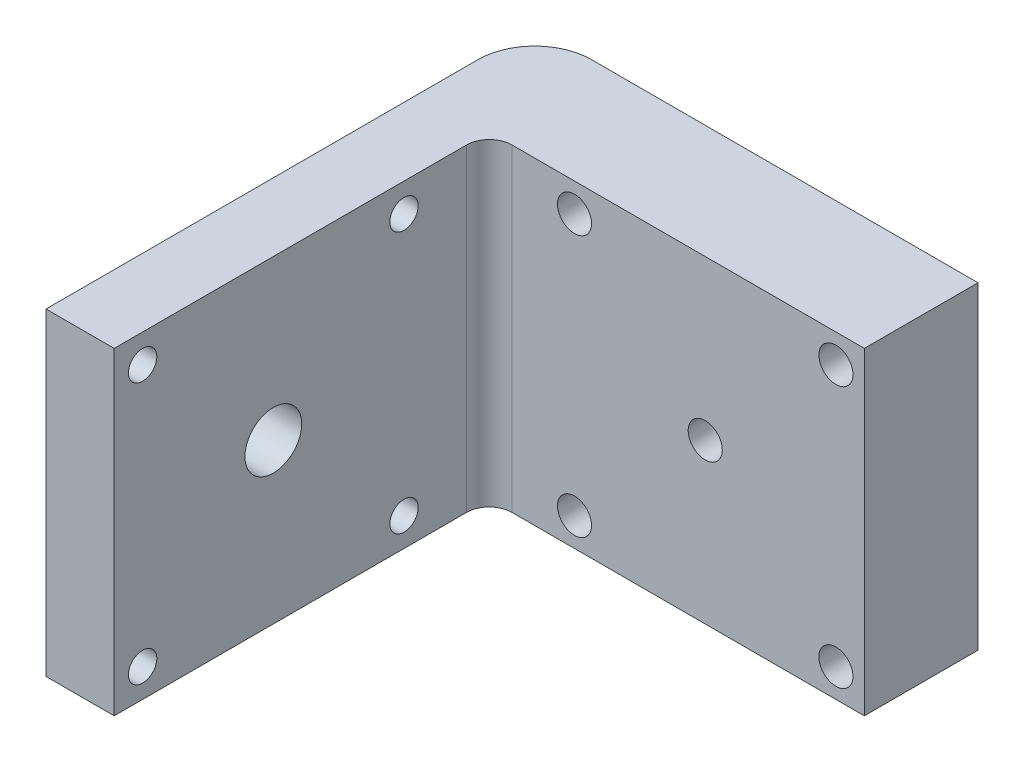
ISO-10303-21;
HEADER;
FILE_DESCRIPTION(('STEP AP214'),'2;1');
FILE_NAME('part.step','',(''),(''),'','','');
FILE_SCHEMA(('AUTOMOTIVE_DESIGN { 1 0 10303 214 1 1 1 1 }'));
ENDSEC;
DATA;
#1=APPLICATION_CONTEXT('core data for automotive mechanical design processes');
#2=APPLICATION_PROTOCOL_DEFINITION('international standard','automotive_design',2000,#1);
#3=PRODUCT_CONTEXT('',#1,'mechanical');
#4=PRODUCT('Part','Part','',(#3));
#5=PRODUCT_RELATED_PRODUCT_CATEGORY('part','',(#4));
#6=PRODUCT_DEFINITION_FORMATION('','',#4);
#7=PRODUCT_DEFINITION_CONTEXT('part definition',#1,'design');
#8=PRODUCT_DEFINITION('design','',#6,#7);
#9=PRODUCT_DEFINITION_SHAPE('','',#8);
#10=(LENGTH_UNIT() NAMED_UNIT(*) SI_UNIT(.MILLI.,.METRE.));
#11=(NAMED_UNIT(*) PLANE_ANGLE_UNIT() SI_UNIT($,.RADIAN.));
#12=(NAMED_UNIT(*) SI_UNIT($,.STERADIAN.) SOLID_ANGLE_UNIT());
#13=UNCERTAINTY_MEASURE_WITH_UNIT(LENGTH_MEASURE(1.E-05),#10,'distance_accuracy_value','');
#14=(GEOMETRIC_REPRESENTATION_CONTEXT(3) GLOBAL_UNCERTAINTY_ASSIGNED_CONTEXT((#13)) GLOBAL_UNIT_ASSIGNED_CONTEXT((#10,
#11,#12)) REPRESENTATION_CONTEXT('',''));
#15=CARTESIAN_POINT('',(0.,0.,0.));
#16=DIRECTION('',(0.,0.,1.));
#17=DIRECTION('',(1.,0.,0.));
#18=AXIS2_PLACEMENT_3D('',#15,#16,#17);
#19=CARTESIAN_POINT('',(0.,14.,10.));
#20=DIRECTION('',(0.,-1.,0.));
#21=DIRECTION('',(0.,0.,-1.));
#22=AXIS2_PLACEMENT_3D('',#19,#20,#21);
#23=PLANE('',#22);
#24=DIRECTION('',(-1.,0.,0.));
#25=VECTOR('',#24,1.);
#26=CARTESIAN_POINT('',(0.,14.,0.));
#27=LINE('',#26,#25);
#28=CARTESIAN_POINT('',(14.,14.,0.));
#29=VERTEX_POINT('',#28);
#30=CARTESIAN_POINT('',(-20.,14.,0.));
#31=VERTEX_POINT('',#30);
#32=EDGE_CURVE('E125',#29,#31,#27,.T.);
#33=ORIENTED_EDGE('',*,*,#32,.T.);
#34=CARTESIAN_POINT('',(-20.,14.,5.));
#35=DIRECTION('',(0.,-1.,0.));
#36=DIRECTION('',(0.,0.,-1.));
#37=AXIS2_PLACEMENT_3D('',#34,#35,#36);
#38=CIRCLE('',#37,5.);
#39=CARTESIAN_POINT('',(-25.,14.,5.));
#40=VERTEX_POINT('',#39);
#41=EDGE_CURVE('E256',#31,#40,#38,.F.);
#42=ORIENTED_EDGE('',*,*,#41,.T.);
#43=DIRECTION('',(0.,0.,-1.));
#44=VECTOR('',#43,1.);
#45=CARTESIAN_POINT('',(-25.,14.,0.));
#46=LINE('',#45,#44);
#47=CARTESIAN_POINT('',(-25.,14.,43.));
#48=VERTEX_POINT('',#47);
#49=EDGE_CURVE('E131',#48,#40,#46,.T.);
#50=ORIENTED_EDGE('',*,*,#49,.F.);
#51=DIRECTION('',(1.,0.,0.));
#52=VECTOR('',#51,1.);
#53=CARTESIAN_POINT('',(-25.,14.,43.));
#54=LINE('',#53,#52);
#55=CARTESIAN_POINT('',(-19.,14.,43.));
#56=VERTEX_POINT('',#55);
#57=EDGE_CURVE('E126',#48,#56,#54,.T.);
#58=ORIENTED_EDGE('',*,*,#57,.T.);
#59=DIRECTION('',(0.,0.,-1.));
#60=VECTOR('',#59,1.);
#61=CARTESIAN_POINT('',(-19.,14.,0.));
#62=LINE('',#61,#60);
#63=CARTESIAN_POINT('',(-19.,14.,12.));
#64=VERTEX_POINT('',#63);
#65=EDGE_CURVE('E162',#56,#64,#62,.T.);
#66=ORIENTED_EDGE('',*,*,#65,.T.);
#67=CARTESIAN_POINT('',(-17.,14.,12.));
#68=DIRECTION('',(0.,-1.,0.));
#69=DIRECTION('',(0.,0.,-1.));
#70=AXIS2_PLACEMENT_3D('',#67,#68,#69);
#71=CIRCLE('',#70,2.);
#72=CARTESIAN_POINT('',(-17.,14.,10.));
#73=VERTEX_POINT('',#72);
#74=EDGE_CURVE('E11',#64,#73,#71,.T.);
#75=ORIENTED_EDGE('',*,*,#74,.T.);
#76=DIRECTION('',(-1.,0.,0.));
#77=VECTOR('',#76,1.);
#78=CARTESIAN_POINT('',(0.,14.,10.));
#79=LINE('',#78,#77);
#80=CARTESIAN_POINT('',(14.,14.,10.));
#81=VERTEX_POINT('',#80);
#82=EDGE_CURVE('E180',#81,#73,#79,.T.);
#83=ORIENTED_EDGE('',*,*,#82,.F.);
#84=DIRECTION('',(0.,0.,-1.));
#85=VECTOR('',#84,1.);
#86=CARTESIAN_POINT('',(14.,14.,10.));
#87=LINE('',#86,#85);
#88=EDGE_CURVE('E212',#81,#29,#87,.T.);
#89=ORIENTED_EDGE('',*,*,#88,.T.);
#90=EDGE_LOOP('',(#33,#42,#50,#58,#66,#75,#83,#89));
#91=FACE_BOUND('',#90,.T.);
#92=ADVANCED_FACE('F39',(#91),#23,.F.);
#93=CARTESIAN_POINT('',(0.,-14.,10.));
#94=DIRECTION('',(0.,-1.,0.));
#95=DIRECTION('',(0.,0.,-1.));
#96=AXIS2_PLACEMENT_3D('',#93,#94,#95);
#97=PLANE('',#96);
#98=DIRECTION('',(0.,0.,1.));
#99=VECTOR('',#98,1.);
#100=CARTESIAN_POINT('',(-25.,-14.,0.));
#101=LINE('',#100,#99);
#102=CARTESIAN_POINT('',(-25.,-14.,5.));
#103=VERTEX_POINT('',#102);
#104=CARTESIAN_POINT('',(-25.,-14.,43.));
#105=VERTEX_POINT('',#104);
#106=EDGE_CURVE('E105',#103,#105,#101,.T.);
#107=ORIENTED_EDGE('',*,*,#106,.F.);
#108=CARTESIAN_POINT('',(-20.,-14.,5.));
#109=DIRECTION('',(0.,-1.,0.));
#110=DIRECTION('',(0.,0.,-1.));
#111=AXIS2_PLACEMENT_3D('',#108,#109,#110);
#112=CIRCLE('',#111,5.);
#113=CARTESIAN_POINT('',(-20.,-14.,0.));
#114=VERTEX_POINT('',#113);
#115=EDGE_CURVE('E250',#103,#114,#112,.T.);
#116=ORIENTED_EDGE('',*,*,#115,.T.);
#117=DIRECTION('',(-1.,0.,0.));
#118=VECTOR('',#117,1.);
#119=CARTESIAN_POINT('',(0.,-14.,0.));
#120=LINE('',#119,#118);
#121=CARTESIAN_POINT('',(14.,-14.,0.));
#122=VERTEX_POINT('',#121);
#123=EDGE_CURVE('E216',#122,#114,#120,.T.);
#124=ORIENTED_EDGE('',*,*,#123,.F.);
#125=DIRECTION('',(0.,0.,-1.));
#126=VECTOR('',#125,1.);
#127=CARTESIAN_POINT('',(14.,-14.,10.));
#128=LINE('',#127,#126);
#129=CARTESIAN_POINT('',(14.,-14.,10.));
#130=VERTEX_POINT('',#129);
#131=EDGE_CURVE('E245',#130,#122,#128,.T.);
#132=ORIENTED_EDGE('',*,*,#131,.F.);
#133=DIRECTION('',(-1.,0.,0.));
#134=VECTOR('',#133,1.);
#135=CARTESIAN_POINT('',(0.,-14.,10.));
#136=LINE('',#135,#134);
#137=CARTESIAN_POINT('',(-17.,-14.,10.));
#138=VERTEX_POINT('',#137);
#139=EDGE_CURVE('E184',#130,#138,#136,.T.);
#140=ORIENTED_EDGE('',*,*,#139,.T.);
#141=CARTESIAN_POINT('',(-17.,-14.,12.));
#142=DIRECTION('',(0.,-1.,0.));
#143=DIRECTION('',(0.,0.,-1.));
#144=AXIS2_PLACEMENT_3D('',#141,#142,#143);
#145=CIRCLE('',#144,2.);
#146=CARTESIAN_POINT('',(-19.,-14.,12.));
#147=VERTEX_POINT('',#146);
#148=EDGE_CURVE('E48',#138,#147,#145,.F.);
#149=ORIENTED_EDGE('',*,*,#148,.T.);
#150=DIRECTION('',(0.,0.,1.));
#151=VECTOR('',#150,1.);
#152=CARTESIAN_POINT('',(-19.,-14.,0.));
#153=LINE('',#152,#151);
#154=CARTESIAN_POINT('',(-19.,-14.,43.));
#155=VERTEX_POINT('',#154);
#156=EDGE_CURVE('E120',#147,#155,#153,.T.);
#157=ORIENTED_EDGE('',*,*,#156,.T.);
#158=DIRECTION('',(1.,0.,0.));
#159=VECTOR('',#158,1.);
#160=CARTESIAN_POINT('',(-25.,-14.,43.));
#161=LINE('',#160,#159);
#162=EDGE_CURVE('E118',#105,#155,#161,.T.);
#163=ORIENTED_EDGE('',*,*,#162,.F.);
#164=EDGE_LOOP('',(#107,#116,#124,#132,#140,#149,#157,#163));
#165=FACE_BOUND('',#164,.T.);
#166=ADVANCED_FACE('F119',(#165),#97,.T.);
#167=CARTESIAN_POINT('',(11.5,11.5,10.));
#168=DIRECTION('',(0.,0.,-1.));
#169=DIRECTION('',(-1.,0.,0.));
#170=AXIS2_PLACEMENT_3D('',#167,#168,#169);
#171=CYLINDRICAL_SURFACE('',#170,1.49999999999999);
#172=CARTESIAN_POINT('',(11.5,11.5,10.));
#173=DIRECTION('',(0.,0.,1.));
#174=DIRECTION('',(1.,0.,0.));
#175=AXIS2_PLACEMENT_3D('',#172,#173,#174);
#176=CIRCLE('',#175,1.49999999999999);
#177=CARTESIAN_POINT('',(13.,11.5,10.));
#178=VERTEX_POINT('',#177);
#179=EDGE_CURVE('E204',#178,#178,#176,.T.);
#180=ORIENTED_EDGE('',*,*,#179,.T.);
#181=EDGE_LOOP('',(#180));
#182=FACE_BOUND('',#181,.T.);
#183=CARTESIAN_POINT('',(11.5,11.5,0.));
#184=DIRECTION('',(0.,0.,1.));
#185=DIRECTION('',(1.,0.,0.));
#186=AXIS2_PLACEMENT_3D('',#183,#184,#185);
#187=CIRCLE('',#186,1.49999999999999);
#188=CARTESIAN_POINT('',(13.,11.5,0.));
#189=VERTEX_POINT('',#188);
#190=EDGE_CURVE('E236',#189,#189,#187,.T.);
#191=ORIENTED_EDGE('',*,*,#190,.F.);
#192=EDGE_LOOP('',(#191));
#193=FACE_BOUND('',#192,.T.);
#194=ADVANCED_FACE('F292',(#182,#193),#171,.F.);
#195=CARTESIAN_POINT('',(-11.5,-11.5,10.));
#196=DIRECTION('',(0.,0.,-1.));
#197=DIRECTION('',(-1.,0.,0.));
#198=AXIS2_PLACEMENT_3D('',#195,#196,#197);
#199=CYLINDRICAL_SURFACE('',#198,1.5);
#200=CARTESIAN_POINT('',(-11.5,-11.5,10.));
#201=DIRECTION('',(0.,0.,1.));
#202=DIRECTION('',(1.,0.,0.));
#203=AXIS2_PLACEMENT_3D('',#200,#201,#202);
#204=CIRCLE('',#203,1.5);
#205=CARTESIAN_POINT('',(-10.,-11.5,10.));
#206=VERTEX_POINT('',#205);
#207=EDGE_CURVE('E200',#206,#206,#204,.T.);
#208=ORIENTED_EDGE('',*,*,#207,.T.);
#209=EDGE_LOOP('',(#208));
#210=FACE_BOUND('',#209,.T.);
#211=CARTESIAN_POINT('',(-11.5,-11.5,0.));
#212=DIRECTION('',(0.,0.,1.));
#213=DIRECTION('',(1.,0.,0.));
#214=AXIS2_PLACEMENT_3D('',#211,#212,#213);
#215=CIRCLE('',#214,1.5);
#216=CARTESIAN_POINT('',(-10.,-11.5,0.));
#217=VERTEX_POINT('',#216);
#218=EDGE_CURVE('E232',#217,#217,#215,.T.);
#219=ORIENTED_EDGE('',*,*,#218,.F.);
#220=EDGE_LOOP('',(#219));
#221=FACE_BOUND('',#220,.T.);
#222=ADVANCED_FACE('F305',(#210,#221),#199,.F.);
#223=CARTESIAN_POINT('',(11.5,-11.5,10.));
#224=DIRECTION('',(0.,0.,-1.));
#225=DIRECTION('',(-1.,0.,0.));
#226=AXIS2_PLACEMENT_3D('',#223,#224,#225);
#227=CYLINDRICAL_SURFACE('',#226,1.49999999999999);
#228=CARTESIAN_POINT('',(11.5,-11.5,10.));
#229=DIRECTION('',(0.,0.,1.));
#230=DIRECTION('',(1.,0.,0.));
#231=AXIS2_PLACEMENT_3D('',#228,#229,#230);
#232=CIRCLE('',#231,1.49999999999999);
#233=CARTESIAN_POINT('',(13.,-11.5,10.));
#234=VERTEX_POINT('',#233);
#235=EDGE_CURVE('E196',#234,#234,#232,.T.);
#236=ORIENTED_EDGE('',*,*,#235,.T.);
#237=EDGE_LOOP('',(#236));
#238=FACE_BOUND('',#237,.T.);
#239=CARTESIAN_POINT('',(11.5,-11.5,0.));
#240=DIRECTION('',(0.,0.,1.));
#241=DIRECTION('',(1.,0.,0.));
#242=AXIS2_PLACEMENT_3D('',#239,#240,#241);
#243=CIRCLE('',#242,1.49999999999999);
#244=CARTESIAN_POINT('',(13.,-11.5,0.));
#245=VERTEX_POINT('',#244);
#246=EDGE_CURVE('E228',#245,#245,#243,.T.);
#247=ORIENTED_EDGE('',*,*,#246,.F.);
#248=EDGE_LOOP('',(#247));
#249=FACE_BOUND('',#248,.T.);
#250=ADVANCED_FACE('F301',(#238,#249),#227,.F.);
#251=CARTESIAN_POINT('',(0.,0.,10.));
#252=DIRECTION('',(0.,0.,-1.));
#253=DIRECTION('',(-1.,0.,0.));
#254=AXIS2_PLACEMENT_3D('',#251,#252,#253);
#255=CYLINDRICAL_SURFACE('',#254,1.5);
#256=CARTESIAN_POINT('',(0.,0.,10.));
#257=DIRECTION('',(0.,0.,1.));
#258=DIRECTION('',(1.,0.,0.));
#259=AXIS2_PLACEMENT_3D('',#256,#257,#258);
#260=CIRCLE('',#259,1.5);
#261=CARTESIAN_POINT('',(1.5,0.,10.));
#262=VERTEX_POINT('',#261);
#263=EDGE_CURVE('E192',#262,#262,#260,.T.);
#264=ORIENTED_EDGE('',*,*,#263,.T.);
#265=EDGE_LOOP('',(#264));
#266=FACE_BOUND('',#265,.T.);
#267=CARTESIAN_POINT('',(0.,0.,0.));
#268=DIRECTION('',(0.,0.,1.));
#269=DIRECTION('',(1.,0.,0.));
#270=AXIS2_PLACEMENT_3D('',#267,#268,#269);
#271=CIRCLE('',#270,1.5);
#272=CARTESIAN_POINT('',(1.5,0.,0.));
#273=VERTEX_POINT('',#272);
#274=EDGE_CURVE('E224',#273,#273,#271,.T.);
#275=ORIENTED_EDGE('',*,*,#274,.F.);
#276=EDGE_LOOP('',(#275));
#277=FACE_BOUND('',#276,.T.);
#278=ADVANCED_FACE('F298',(#266,#277),#255,.F.);
#279=CARTESIAN_POINT('',(14.,0.,10.));
#280=DIRECTION('',(1.,0.,0.));
#281=DIRECTION('',(0.,1.,0.));
#282=AXIS2_PLACEMENT_3D('',#279,#280,#281);
#283=PLANE('',#282);
#284=DIRECTION('',(0.,-1.,0.));
#285=VECTOR('',#284,1.);
#286=CARTESIAN_POINT('',(14.,0.,0.));
#287=LINE('',#286,#285);
#288=EDGE_CURVE('E220',#29,#122,#287,.T.);
#289=ORIENTED_EDGE('',*,*,#288,.F.);
#290=ORIENTED_EDGE('',*,*,#88,.F.);
#291=DIRECTION('',(0.,-1.,0.));
#292=VECTOR('',#291,1.);
#293=CARTESIAN_POINT('',(14.,0.,10.));
#294=LINE('',#293,#292);
#295=EDGE_CURVE('E188',#81,#130,#294,.T.);
#296=ORIENTED_EDGE('',*,*,#295,.T.);
#297=ORIENTED_EDGE('',*,*,#131,.T.);
#298=EDGE_LOOP('',(#289,#290,#296,#297));
#299=FACE_BOUND('',#298,.T.);
#300=ADVANCED_FACE('F277',(#299),#283,.T.);
#301=CARTESIAN_POINT('',(-11.5,11.5,10.));
#302=DIRECTION('',(0.,0.,-1.));
#303=DIRECTION('',(-1.,0.,0.));
#304=AXIS2_PLACEMENT_3D('',#301,#302,#303);
#305=CYLINDRICAL_SURFACE('',#304,1.5);
#306=CARTESIAN_POINT('',(-11.5,11.5,10.));
#307=DIRECTION('',(0.,0.,1.));
#308=DIRECTION('',(1.,0.,0.));
#309=AXIS2_PLACEMENT_3D('',#306,#307,#308);
#310=CIRCLE('',#309,1.5);
#311=CARTESIAN_POINT('',(-10.,11.5,10.));
#312=VERTEX_POINT('',#311);
#313=EDGE_CURVE('E208',#312,#312,#310,.T.);
#314=ORIENTED_EDGE('',*,*,#313,.T.);
#315=EDGE_LOOP('',(#314));
#316=FACE_BOUND('',#315,.T.);
#317=CARTESIAN_POINT('',(-11.5,11.5,0.));
#318=DIRECTION('',(0.,0.,1.));
#319=DIRECTION('',(1.,0.,0.));
#320=AXIS2_PLACEMENT_3D('',#317,#318,#319);
#321=CIRCLE('',#320,1.5);
#322=CARTESIAN_POINT('',(-10.,11.5,0.));
#323=VERTEX_POINT('',#322);
#324=EDGE_CURVE('E185',#323,#323,#321,.T.);
#325=ORIENTED_EDGE('',*,*,#324,.F.);
#326=EDGE_LOOP('',(#325));
#327=FACE_BOUND('',#326,.T.);
#328=ADVANCED_FACE('F297',(#316,#327),#305,.F.);
#329=CARTESIAN_POINT('',(0.,0.,10.));
#330=DIRECTION('',(0.,0.,1.));
#331=DIRECTION('',(1.,0.,0.));
#332=AXIS2_PLACEMENT_3D('',#329,#330,#331);
#333=PLANE('',#332);
#334=ORIENTED_EDGE('',*,*,#82,.T.);
#335=DIRECTION('',(0.,-1.,0.));
#336=VECTOR('',#335,1.);
#337=CARTESIAN_POINT('',(-17.,0.,10.));
#338=LINE('',#337,#336);
#339=EDGE_CURVE('E259',#73,#138,#338,.T.);
#340=ORIENTED_EDGE('',*,*,#339,.T.);
#341=ORIENTED_EDGE('',*,*,#139,.F.);
#342=ORIENTED_EDGE('',*,*,#295,.F.);
#343=EDGE_LOOP('',(#334,#340,#341,#342));
#344=FACE_BOUND('',#343,.T.);
#345=ORIENTED_EDGE('',*,*,#263,.F.);
#346=EDGE_LOOP('',(#345));
#347=FACE_BOUND('',#346,.T.);
#348=ORIENTED_EDGE('',*,*,#235,.F.);
#349=EDGE_LOOP('',(#348));
#350=FACE_BOUND('',#349,.T.);
#351=ORIENTED_EDGE('',*,*,#207,.F.);
#352=EDGE_LOOP('',(#351));
#353=FACE_BOUND('',#352,.T.);
#354=ORIENTED_EDGE('',*,*,#179,.F.);
#355=EDGE_LOOP('',(#354));
#356=FACE_BOUND('',#355,.T.);
#357=ORIENTED_EDGE('',*,*,#313,.F.);
#358=EDGE_LOOP('',(#357));
#359=FACE_BOUND('',#358,.T.);
#360=ADVANCED_FACE('F268',(#344,#347,#350,#353,#356,#359),#333,.T.);
#361=CARTESIAN_POINT('',(0.,0.,0.));
#362=DIRECTION('',(0.,0.,1.));
#363=DIRECTION('',(1.,0.,0.));
#364=AXIS2_PLACEMENT_3D('',#361,#362,#363);
#365=PLANE('',#364);
#366=ORIENTED_EDGE('',*,*,#123,.T.);
#367=DIRECTION('',(0.,-1.,0.));
#368=VECTOR('',#367,1.);
#369=CARTESIAN_POINT('',(-20.,14.,0.));
#370=LINE('',#369,#368);
#371=EDGE_CURVE('E253',#114,#31,#370,.F.);
#372=ORIENTED_EDGE('',*,*,#371,.T.);
#373=ORIENTED_EDGE('',*,*,#32,.F.);
#374=ORIENTED_EDGE('',*,*,#288,.T.);
#375=EDGE_LOOP('',(#366,#372,#373,#374));
#376=FACE_BOUND('',#375,.T.);
#377=ORIENTED_EDGE('',*,*,#274,.T.);
#378=EDGE_LOOP('',(#377));
#379=FACE_BOUND('',#378,.T.);
#380=ORIENTED_EDGE('',*,*,#246,.T.);
#381=EDGE_LOOP('',(#380));
#382=FACE_BOUND('',#381,.T.);
#383=ORIENTED_EDGE('',*,*,#218,.T.);
#384=EDGE_LOOP('',(#383));
#385=FACE_BOUND('',#384,.T.);
#386=ORIENTED_EDGE('',*,*,#190,.T.);
#387=EDGE_LOOP('',(#386));
#388=FACE_BOUND('',#387,.T.);
#389=ORIENTED_EDGE('',*,*,#324,.T.);
#390=EDGE_LOOP('',(#389));
#391=FACE_BOUND('',#390,.T.);
#392=ADVANCED_FACE('F316',(#376,#379,#382,#385,#388,#391),#365,.F.);
#393=CARTESIAN_POINT('',(-25.,0.,43.));
#394=DIRECTION('',(0.,0.,1.));
#395=DIRECTION('',(1.,0.,0.));
#396=AXIS2_PLACEMENT_3D('',#393,#394,#395);
#397=PLANE('',#396);
#398=DIRECTION('',(0.,-1.,0.));
#399=VECTOR('',#398,1.);
#400=CARTESIAN_POINT('',(-19.,0.,43.));
#401=LINE('',#400,#399);
#402=EDGE_CURVE('E159',#56,#155,#401,.T.);
#403=ORIENTED_EDGE('',*,*,#402,.F.);
#404=ORIENTED_EDGE('',*,*,#57,.F.);
#405=DIRECTION('',(0.,-1.,0.));
#406=VECTOR('',#405,1.);
#407=CARTESIAN_POINT('',(-25.,0.,43.));
#408=LINE('',#407,#406);
#409=EDGE_CURVE('E111',#48,#105,#408,.T.);
#410=ORIENTED_EDGE('',*,*,#409,.T.);
#411=ORIENTED_EDGE('',*,*,#162,.T.);
#412=EDGE_LOOP('',(#403,#404,#410,#411));
#413=FACE_BOUND('',#412,.T.);
#414=ADVANCED_FACE('F128',(#413),#397,.T.);
#415=CARTESIAN_POINT('',(-25.,11.5,17.5));
#416=DIRECTION('',(1.,0.,0.));
#417=DIRECTION('',(0.,1.,0.));
#418=AXIS2_PLACEMENT_3D('',#415,#416,#417);
#419=CYLINDRICAL_SURFACE('',#418,1.25);
#420=CARTESIAN_POINT('',(-25.,11.5,17.5));
#421=DIRECTION('',(-1.,0.,0.));
#422=DIRECTION('',(0.,-1.,0.));
#423=AXIS2_PLACEMENT_3D('',#420,#421,#422);
#424=CIRCLE('',#423,1.25);
#425=CARTESIAN_POINT('',(-25.,10.25,17.5));
#426=VERTEX_POINT('',#425);
#427=EDGE_CURVE('E141',#426,#426,#424,.T.);
#428=ORIENTED_EDGE('',*,*,#427,.T.);
#429=EDGE_LOOP('',(#428));
#430=FACE_BOUND('',#429,.T.);
#431=CARTESIAN_POINT('',(-19.,11.5,17.5));
#432=DIRECTION('',(-1.,0.,0.));
#433=DIRECTION('',(0.,-1.,0.));
#434=AXIS2_PLACEMENT_3D('',#431,#432,#433);
#435=CIRCLE('',#434,1.25);
#436=CARTESIAN_POINT('',(-19.,10.25,17.5));
#437=VERTEX_POINT('',#436);
#438=EDGE_CURVE('E169',#437,#437,#435,.T.);
#439=ORIENTED_EDGE('',*,*,#438,.F.);
#440=EDGE_LOOP('',(#439));
#441=FACE_BOUND('',#440,.T.);
#442=ADVANCED_FACE('F334',(#430,#441),#419,.F.);
#443=CARTESIAN_POINT('',(-25.,-11.5,40.5));
#444=DIRECTION('',(1.,0.,0.));
#445=DIRECTION('',(0.,1.,0.));
#446=AXIS2_PLACEMENT_3D('',#443,#444,#445);
#447=CYLINDRICAL_SURFACE('',#446,1.25);
#448=CARTESIAN_POINT('',(-25.,-11.5,40.5));
#449=DIRECTION('',(-1.,0.,0.));
#450=DIRECTION('',(0.,-1.,0.));
#451=AXIS2_PLACEMENT_3D('',#448,#449,#450);
#452=CIRCLE('',#451,1.25);
#453=CARTESIAN_POINT('',(-25.,-12.75,40.5));
#454=VERTEX_POINT('',#453);
#455=EDGE_CURVE('E134',#454,#454,#452,.T.);
#456=ORIENTED_EDGE('',*,*,#455,.T.);
#457=EDGE_LOOP('',(#456));
#458=FACE_BOUND('',#457,.T.);
#459=CARTESIAN_POINT('',(-19.,-11.5,40.5));
#460=DIRECTION('',(-1.,0.,0.));
#461=DIRECTION('',(0.,-1.,0.));
#462=AXIS2_PLACEMENT_3D('',#459,#460,#461);
#463=CIRCLE('',#462,1.25);
#464=CARTESIAN_POINT('',(-19.,-12.75,40.5));
#465=VERTEX_POINT('',#464);
#466=EDGE_CURVE('E165',#465,#465,#463,.T.);
#467=ORIENTED_EDGE('',*,*,#466,.F.);
#468=EDGE_LOOP('',(#467));
#469=FACE_BOUND('',#468,.T.);
#470=ADVANCED_FACE('F330',(#458,#469),#447,.F.);
#471=CARTESIAN_POINT('',(-25.,11.5,40.5));
#472=DIRECTION('',(1.,0.,0.));
#473=DIRECTION('',(0.,1.,0.));
#474=AXIS2_PLACEMENT_3D('',#471,#472,#473);
#475=CYLINDRICAL_SURFACE('',#474,1.25);
#476=CARTESIAN_POINT('',(-25.,11.5,40.5));
#477=DIRECTION('',(-1.,0.,0.));
#478=DIRECTION('',(0.,-1.,0.));
#479=AXIS2_PLACEMENT_3D('',#476,#477,#478);
#480=CIRCLE('',#479,1.25);
#481=CARTESIAN_POINT('',(-25.,10.25,40.5));
#482=VERTEX_POINT('',#481);
#483=EDGE_CURVE('E115',#482,#482,#480,.T.);
#484=ORIENTED_EDGE('',*,*,#483,.T.);
#485=EDGE_LOOP('',(#484));
#486=FACE_BOUND('',#485,.T.);
#487=CARTESIAN_POINT('',(-19.,11.5,40.5));
#488=DIRECTION('',(-1.,0.,0.));
#489=DIRECTION('',(0.,-1.,0.));
#490=AXIS2_PLACEMENT_3D('',#487,#488,#489);
#491=CIRCLE('',#490,1.25);
#492=CARTESIAN_POINT('',(-19.,10.25,40.5));
#493=VERTEX_POINT('',#492);
#494=EDGE_CURVE('E153',#493,#493,#491,.T.);
#495=ORIENTED_EDGE('',*,*,#494,.F.);
#496=EDGE_LOOP('',(#495));
#497=FACE_BOUND('',#496,.T.);
#498=ADVANCED_FACE('F326',(#486,#497),#475,.F.);
#499=CARTESIAN_POINT('',(-25.,0.,29.));
#500=DIRECTION('',(1.,0.,0.));
#501=DIRECTION('',(0.,1.,0.));
#502=AXIS2_PLACEMENT_3D('',#499,#500,#501);
#503=CYLINDRICAL_SURFACE('',#502,2.5);
#504=CARTESIAN_POINT('',(-25.,0.,29.));
#505=DIRECTION('',(-1.,0.,0.));
#506=DIRECTION('',(0.,-1.,0.));
#507=AXIS2_PLACEMENT_3D('',#504,#505,#506);
#508=CIRCLE('',#507,2.5);
#509=CARTESIAN_POINT('',(-25.,-2.5,29.));
#510=VERTEX_POINT('',#509);
#511=EDGE_CURVE('E177',#510,#510,#508,.T.);
#512=ORIENTED_EDGE('',*,*,#511,.T.);
#513=EDGE_LOOP('',(#512));
#514=FACE_BOUND('',#513,.T.);
#515=CARTESIAN_POINT('',(-19.,0.,29.));
#516=DIRECTION('',(-1.,0.,0.));
#517=DIRECTION('',(0.,-1.,0.));
#518=AXIS2_PLACEMENT_3D('',#515,#516,#517);
#519=CIRCLE('',#518,2.5);
#520=CARTESIAN_POINT('',(-19.,-2.5,29.));
#521=VERTEX_POINT('',#520);
#522=EDGE_CURVE('E149',#521,#521,#519,.T.);
#523=ORIENTED_EDGE('',*,*,#522,.F.);
#524=EDGE_LOOP('',(#523));
#525=FACE_BOUND('',#524,.T.);
#526=ADVANCED_FACE('F322',(#514,#525),#503,.F.);
#527=CARTESIAN_POINT('',(-25.,-11.5,17.5));
#528=DIRECTION('',(1.,0.,0.));
#529=DIRECTION('',(0.,1.,0.));
#530=AXIS2_PLACEMENT_3D('',#527,#528,#529);
#531=CYLINDRICAL_SURFACE('',#530,1.25);
#532=CARTESIAN_POINT('',(-25.,-11.5,17.5));
#533=DIRECTION('',(-1.,0.,0.));
#534=DIRECTION('',(0.,-1.,0.));
#535=AXIS2_PLACEMENT_3D('',#532,#533,#534);
#536=CIRCLE('',#535,1.25);
#537=CARTESIAN_POINT('',(-25.,-12.75,17.5));
#538=VERTEX_POINT('',#537);
#539=EDGE_CURVE('E145',#538,#538,#536,.T.);
#540=ORIENTED_EDGE('',*,*,#539,.T.);
#541=EDGE_LOOP('',(#540));
#542=FACE_BOUND('',#541,.T.);
#543=CARTESIAN_POINT('',(-19.,-11.5,17.5));
#544=DIRECTION('',(-1.,0.,0.));
#545=DIRECTION('',(0.,-1.,0.));
#546=AXIS2_PLACEMENT_3D('',#543,#544,#545);
#547=CIRCLE('',#546,1.25);
#548=CARTESIAN_POINT('',(-19.,-12.75,17.5));
#549=VERTEX_POINT('',#548);
#550=EDGE_CURVE('E173',#549,#549,#547,.T.);
#551=ORIENTED_EDGE('',*,*,#550,.F.);
#552=EDGE_LOOP('',(#551));
#553=FACE_BOUND('',#552,.T.);
#554=ADVANCED_FACE('F325',(#542,#553),#531,.F.);
#555=CARTESIAN_POINT('',(-25.,0.,0.));
#556=DIRECTION('',(-1.,0.,0.));
#557=DIRECTION('',(0.,-1.,0.));
#558=AXIS2_PLACEMENT_3D('',#555,#556,#557);
#559=PLANE('',#558);
#560=ORIENTED_EDGE('',*,*,#511,.F.);
#561=EDGE_LOOP('',(#560));
#562=FACE_BOUND('',#561,.T.);
#563=ORIENTED_EDGE('',*,*,#483,.F.);
#564=EDGE_LOOP('',(#563));
#565=FACE_BOUND('',#564,.T.);
#566=ORIENTED_EDGE('',*,*,#49,.T.);
#567=DIRECTION('',(0.,-1.,0.));
#568=VECTOR('',#567,1.);
#569=CARTESIAN_POINT('',(-25.,-14.,5.));
#570=LINE('',#569,#568);
#571=EDGE_CURVE('E113',#40,#103,#570,.T.);
#572=ORIENTED_EDGE('',*,*,#571,.T.);
#573=ORIENTED_EDGE('',*,*,#106,.T.);
#574=ORIENTED_EDGE('',*,*,#409,.F.);
#575=EDGE_LOOP('',(#566,#572,#573,#574));
#576=FACE_BOUND('',#575,.T.);
#577=ORIENTED_EDGE('',*,*,#455,.F.);
#578=EDGE_LOOP('',(#577));
#579=FACE_BOUND('',#578,.T.);
#580=ORIENTED_EDGE('',*,*,#427,.F.);
#581=EDGE_LOOP('',(#580));
#582=FACE_BOUND('',#581,.T.);
#583=ORIENTED_EDGE('',*,*,#539,.F.);
#584=EDGE_LOOP('',(#583));
#585=FACE_BOUND('',#584,.T.);
#586=ADVANCED_FACE('F108',(#562,#565,#576,#579,#582,#585),#559,.T.);
#587=CARTESIAN_POINT('',(-19.,0.,0.));
#588=DIRECTION('',(-1.,0.,0.));
#589=DIRECTION('',(0.,-1.,0.));
#590=AXIS2_PLACEMENT_3D('',#587,#588,#589);
#591=PLANE('',#590);
#592=ORIENTED_EDGE('',*,*,#156,.F.);
#593=DIRECTION('',(0.,-1.,0.));
#594=VECTOR('',#593,1.);
#595=CARTESIAN_POINT('',(-19.,0.,12.));
#596=LINE('',#595,#594);
#597=EDGE_CURVE('E61',#147,#64,#596,.F.);
#598=ORIENTED_EDGE('',*,*,#597,.T.);
#599=ORIENTED_EDGE('',*,*,#65,.F.);
#600=ORIENTED_EDGE('',*,*,#402,.T.);
#601=EDGE_LOOP('',(#592,#598,#599,#600));
#602=FACE_BOUND('',#601,.T.);
#603=ORIENTED_EDGE('',*,*,#522,.T.);
#604=EDGE_LOOP('',(#603));
#605=FACE_BOUND('',#604,.T.);
#606=ORIENTED_EDGE('',*,*,#494,.T.);
#607=EDGE_LOOP('',(#606));
#608=FACE_BOUND('',#607,.T.);
#609=ORIENTED_EDGE('',*,*,#466,.T.);
#610=EDGE_LOOP('',(#609));
#611=FACE_BOUND('',#610,.T.);
#612=ORIENTED_EDGE('',*,*,#438,.T.);
#613=EDGE_LOOP('',(#612));
#614=FACE_BOUND('',#613,.T.);
#615=ORIENTED_EDGE('',*,*,#550,.T.);
#616=EDGE_LOOP('',(#615));
#617=FACE_BOUND('',#616,.T.);
#618=ADVANCED_FACE('F285',(#602,#605,#608,#611,#614,#617),#591,.F.);
#619=CARTESIAN_POINT('',(-20.,0.,5.));
#620=DIRECTION('',(0.,1.,0.));
#621=DIRECTION('',(-1.,0.,0.));
#622=AXIS2_PLACEMENT_3D('',#619,#620,#621);
#623=CYLINDRICAL_SURFACE('',#622,5.);
#624=ORIENTED_EDGE('',*,*,#41,.F.);
#625=ORIENTED_EDGE('',*,*,#371,.F.);
#626=ORIENTED_EDGE('',*,*,#115,.F.);
#627=ORIENTED_EDGE('',*,*,#571,.F.);
#628=EDGE_LOOP('',(#624,#625,#626,#627));
#629=FACE_BOUND('',#628,.T.);
#630=ADVANCED_FACE('F281',(#629),#623,.T.);
#631=CARTESIAN_POINT('',(-17.,0.,12.));
#632=DIRECTION('',(0.,-1.,0.));
#633=DIRECTION('',(1.,0.,0.));
#634=AXIS2_PLACEMENT_3D('',#631,#632,#633);
#635=CYLINDRICAL_SURFACE('',#634,2.);
#636=ORIENTED_EDGE('',*,*,#74,.F.);
#637=ORIENTED_EDGE('',*,*,#597,.F.);
#638=ORIENTED_EDGE('',*,*,#148,.F.);
#639=ORIENTED_EDGE('',*,*,#339,.F.);
#640=EDGE_LOOP('',(#636,#637,#638,#639));
#641=FACE_BOUND('',#640,.T.);
#642=ADVANCED_FACE('F41',(#641),#635,.F.);
#643=CLOSED_SHELL('',(#92,#166,#194,#222,#250,#278,#300,#328,#360,#392,#414,#442,#470,#498,#526,
#554,#586,#618,#630,#642));
#644=MANIFOLD_SOLID_BREP('B2',#643);
#645=ADVANCED_BREP_SHAPE_REPRESENTATION('',(#18,#644),#14);
#646=SHAPE_DEFINITION_REPRESENTATION(#9,#645);
ENDSEC;
END-ISO-10303-21;
